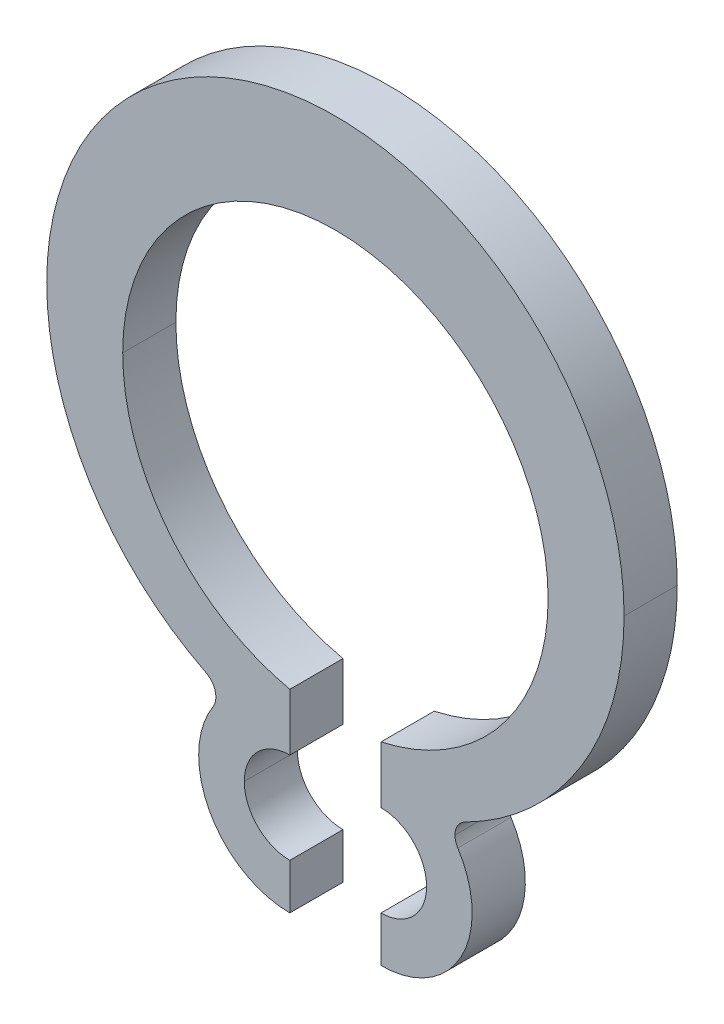
ISO-10303-21;
HEADER;
FILE_DESCRIPTION(('STEP AP214'),'2;1');
FILE_NAME('part.step','',(''),(''),'','','');
FILE_SCHEMA(('AUTOMOTIVE_DESIGN { 1 0 10303 214 1 1 1 1 }'));
ENDSEC;
DATA;
#1=APPLICATION_CONTEXT('core data for automotive mechanical design processes');
#2=APPLICATION_PROTOCOL_DEFINITION('international standard','automotive_design',2000,#1);
#3=PRODUCT_CONTEXT('',#1,'mechanical');
#4=PRODUCT('Part','Part','',(#3));
#5=PRODUCT_RELATED_PRODUCT_CATEGORY('part','',(#4));
#6=PRODUCT_DEFINITION_FORMATION('','',#4);
#7=PRODUCT_DEFINITION_CONTEXT('part definition',#1,'design');
#8=PRODUCT_DEFINITION('design','',#6,#7);
#9=PRODUCT_DEFINITION_SHAPE('','',#8);
#10=(LENGTH_UNIT() NAMED_UNIT(*) SI_UNIT(.MILLI.,.METRE.));
#11=(NAMED_UNIT(*) PLANE_ANGLE_UNIT() SI_UNIT($,.RADIAN.));
#12=(NAMED_UNIT(*) SI_UNIT($,.STERADIAN.) SOLID_ANGLE_UNIT());
#13=UNCERTAINTY_MEASURE_WITH_UNIT(LENGTH_MEASURE(1.E-05),#10,'distance_accuracy_value','');
#14=(GEOMETRIC_REPRESENTATION_CONTEXT(3) GLOBAL_UNCERTAINTY_ASSIGNED_CONTEXT((#13)) GLOBAL_UNIT_ASSIGNED_CONTEXT((#10,
#11,#12)) REPRESENTATION_CONTEXT('',''));
#15=CARTESIAN_POINT('',(0.,0.,0.));
#16=DIRECTION('',(0.,0.,1.));
#17=DIRECTION('',(1.,0.,0.));
#18=AXIS2_PLACEMENT_3D('',#15,#16,#17);
#19=CARTESIAN_POINT('',(-0.6,-4.08495886623547,0.));
#20=DIRECTION('',(0.,0.,1.));
#21=DIRECTION('',(1.,0.,0.));
#22=AXIS2_PLACEMENT_3D('',#19,#20,#21);
#23=PLANE('',#22);
#24=CARTESIAN_POINT('',(-0.6,-4.08495886623547,0.));
#25=DIRECTION('',(0.,0.,1.));
#26=DIRECTION('',(1.,0.,0.));
#27=AXIS2_PLACEMENT_3D('',#24,#25,#26);
#28=CIRCLE('',#27,1.2);
#29=CARTESIAN_POINT('',(-1.61140871688524,-3.43916291749581,0.));
#30=VERTEX_POINT('',#29);
#31=CARTESIAN_POINT('',(-1.8,-4.08495886623547,0.));
#32=VERTEX_POINT('',#31);
#33=EDGE_CURVE('E310',#30,#32,#28,.T.);
#34=ORIENTED_EDGE('',*,*,#33,.F.);
#35=CARTESIAN_POINT('',(-1.81369046026228,-3.31000372774788,0.));
#36=DIRECTION('',(0.,0.,-1.));
#37=DIRECTION('',(1.,0.,0.));
#38=AXIS2_PLACEMENT_3D('',#35,#36,#37);
#39=CIRCLE('',#38,0.24);
#40=CARTESIAN_POINT('',(-1.70594647252393,-3.09554806075295,0.));
#41=VERTEX_POINT('',#40);
#42=EDGE_CURVE('E28',#41,#30,#39,.T.);
#43=ORIENTED_EDGE('',*,*,#42,.F.);
#44=CARTESIAN_POINT('',(0.,0.3,0.));
#45=DIRECTION('',(0.,0.,1.));
#46=DIRECTION('',(1.,0.,0.));
#47=AXIS2_PLACEMENT_3D('',#44,#45,#46);
#48=CIRCLE('',#47,3.8);
#49=CARTESIAN_POINT('',(-3.8,0.3,0.));
#50=VERTEX_POINT('',#49);
#51=EDGE_CURVE('E298',#50,#41,#48,.T.);
#52=ORIENTED_EDGE('',*,*,#51,.F.);
#53=CARTESIAN_POINT('',(0.,0.3,0.));
#54=DIRECTION('',(0.,0.,1.));
#55=DIRECTION('',(1.,0.,0.));
#56=AXIS2_PLACEMENT_3D('',#53,#54,#55);
#57=CIRCLE('',#56,3.8);
#58=CARTESIAN_POINT('',(3.8,0.3,0.));
#59=VERTEX_POINT('',#58);
#60=EDGE_CURVE('E244',#59,#50,#57,.T.);
#61=ORIENTED_EDGE('',*,*,#60,.F.);
#62=CARTESIAN_POINT('',(0.,0.3,0.));
#63=DIRECTION('',(0.,0.,1.));
#64=DIRECTION('',(1.,0.,0.));
#65=AXIS2_PLACEMENT_3D('',#62,#63,#64);
#66=CIRCLE('',#65,3.8);
#67=CARTESIAN_POINT('',(1.70594647252393,-3.09554806075295,0.));
#68=VERTEX_POINT('',#67);
#69=EDGE_CURVE('E268',#68,#59,#66,.T.);
#70=ORIENTED_EDGE('',*,*,#69,.F.);
#71=CARTESIAN_POINT('',(1.81369046026228,-3.31000372774788,0.));
#72=DIRECTION('',(0.,0.,-1.));
#73=DIRECTION('',(1.,0.,0.));
#74=AXIS2_PLACEMENT_3D('',#71,#72,#73);
#75=CIRCLE('',#74,0.24);
#76=CARTESIAN_POINT('',(1.57369046026228,-3.31000372774788,0.));
#77=VERTEX_POINT('',#76);
#78=EDGE_CURVE('E229',#77,#68,#75,.T.);
#79=ORIENTED_EDGE('',*,*,#78,.F.);
#80=CARTESIAN_POINT('',(1.81369046026228,-3.31000372774788,0.));
#81=DIRECTION('',(0.,0.,-1.));
#82=DIRECTION('',(1.,0.,0.));
#83=AXIS2_PLACEMENT_3D('',#80,#81,#82);
#84=CIRCLE('',#83,0.24);
#85=CARTESIAN_POINT('',(1.61140871688524,-3.43916291749581,0.));
#86=VERTEX_POINT('',#85);
#87=EDGE_CURVE('E274',#86,#77,#84,.T.);
#88=ORIENTED_EDGE('',*,*,#87,.F.);
#89=CARTESIAN_POINT('',(0.6,-4.08495886623547,0.));
#90=DIRECTION('',(0.,0.,1.));
#91=DIRECTION('',(1.,0.,0.));
#92=AXIS2_PLACEMENT_3D('',#89,#90,#91);
#93=CIRCLE('',#92,1.2);
#94=CARTESIAN_POINT('',(0.6,-5.28495886623547,0.));
#95=VERTEX_POINT('',#94);
#96=EDGE_CURVE('E210',#95,#86,#93,.T.);
#97=ORIENTED_EDGE('',*,*,#96,.F.);
#98=DIRECTION('',(0.,-1.,0.));
#99=VECTOR('',#98,1.);
#100=CARTESIAN_POINT('',(0.6,-4.68495886623547,0.));
#101=LINE('',#100,#99);
#102=CARTESIAN_POINT('',(0.6,-4.68495886623547,0.));
#103=VERTEX_POINT('',#102);
#104=EDGE_CURVE('E213',#103,#95,#101,.T.);
#105=ORIENTED_EDGE('',*,*,#104,.F.);
#106=CARTESIAN_POINT('',(0.6,-4.08495886623547,0.));
#107=DIRECTION('',(0.,0.,-1.));
#108=DIRECTION('',(1.,0.,0.));
#109=AXIS2_PLACEMENT_3D('',#106,#107,#108);
#110=CIRCLE('',#109,0.6);
#111=CARTESIAN_POINT('',(0.6,-3.48495886623547,0.));
#112=VERTEX_POINT('',#111);
#113=EDGE_CURVE('E278',#112,#103,#110,.T.);
#114=ORIENTED_EDGE('',*,*,#113,.F.);
#115=DIRECTION('',(0.,-1.,0.));
#116=VECTOR('',#115,1.);
#117=CARTESIAN_POINT('',(0.6,-2.73495886623547,0.));
#118=LINE('',#117,#116);
#119=CARTESIAN_POINT('',(0.6,-2.73495886623547,0.));
#120=VERTEX_POINT('',#119);
#121=EDGE_CURVE('E266',#120,#112,#118,.T.);
#122=ORIENTED_EDGE('',*,*,#121,.F.);
#123=CARTESIAN_POINT('',(0.,0.,0.));
#124=DIRECTION('',(0.,0.,-1.));
#125=DIRECTION('',(1.,0.,0.));
#126=AXIS2_PLACEMENT_3D('',#123,#124,#125);
#127=CIRCLE('',#126,2.8);
#128=CARTESIAN_POINT('',(2.8,0.,0.));
#129=VERTEX_POINT('',#128);
#130=EDGE_CURVE('E361',#129,#120,#127,.T.);
#131=ORIENTED_EDGE('',*,*,#130,.F.);
#132=CARTESIAN_POINT('',(0.,0.,0.));
#133=DIRECTION('',(0.,0.,-1.));
#134=DIRECTION('',(1.,0.,0.));
#135=AXIS2_PLACEMENT_3D('',#132,#133,#134);
#136=CIRCLE('',#135,2.8);
#137=CARTESIAN_POINT('',(-2.8,0.,0.));
#138=VERTEX_POINT('',#137);
#139=EDGE_CURVE('E255',#138,#129,#136,.T.);
#140=ORIENTED_EDGE('',*,*,#139,.F.);
#141=CARTESIAN_POINT('',(0.,0.,0.));
#142=DIRECTION('',(0.,0.,-1.));
#143=DIRECTION('',(1.,0.,0.));
#144=AXIS2_PLACEMENT_3D('',#141,#142,#143);
#145=CIRCLE('',#144,2.8);
#146=CARTESIAN_POINT('',(-0.6,-2.73495886623547,0.));
#147=VERTEX_POINT('',#146);
#148=EDGE_CURVE('E263',#147,#138,#145,.T.);
#149=ORIENTED_EDGE('',*,*,#148,.F.);
#150=DIRECTION('',(0.,1.,0.));
#151=VECTOR('',#150,1.);
#152=CARTESIAN_POINT('',(-0.6,-2.73495886623547,0.));
#153=LINE('',#152,#151);
#154=CARTESIAN_POINT('',(-0.6,-3.48495886623547,0.));
#155=VERTEX_POINT('',#154);
#156=EDGE_CURVE('E230',#155,#147,#153,.T.);
#157=ORIENTED_EDGE('',*,*,#156,.F.);
#158=CARTESIAN_POINT('',(-0.6,-4.08495886623547,0.));
#159=DIRECTION('',(0.,0.,-1.));
#160=DIRECTION('',(1.,0.,0.));
#161=AXIS2_PLACEMENT_3D('',#158,#159,#160);
#162=CIRCLE('',#161,0.6);
#163=CARTESIAN_POINT('',(-1.2,-4.08495886623547,0.));
#164=VERTEX_POINT('',#163);
#165=EDGE_CURVE('E293',#164,#155,#162,.T.);
#166=ORIENTED_EDGE('',*,*,#165,.F.);
#167=CARTESIAN_POINT('',(-0.6,-4.08495886623547,0.));
#168=DIRECTION('',(0.,0.,-1.));
#169=DIRECTION('',(1.,0.,0.));
#170=AXIS2_PLACEMENT_3D('',#167,#168,#169);
#171=CIRCLE('',#170,0.6);
#172=CARTESIAN_POINT('',(-0.6,-4.68495886623547,0.));
#173=VERTEX_POINT('',#172);
#174=EDGE_CURVE('E235',#173,#164,#171,.T.);
#175=ORIENTED_EDGE('',*,*,#174,.F.);
#176=DIRECTION('',(0.,1.,0.));
#177=VECTOR('',#176,1.);
#178=CARTESIAN_POINT('',(-0.6,-4.68495886623547,0.));
#179=LINE('',#178,#177);
#180=CARTESIAN_POINT('',(-0.6,-5.28495886623547,0.));
#181=VERTEX_POINT('',#180);
#182=EDGE_CURVE('E314',#181,#173,#179,.T.);
#183=ORIENTED_EDGE('',*,*,#182,.F.);
#184=CARTESIAN_POINT('',(-0.6,-4.08495886623547,0.));
#185=DIRECTION('',(0.,0.,1.));
#186=DIRECTION('',(1.,0.,0.));
#187=AXIS2_PLACEMENT_3D('',#184,#185,#186);
#188=CIRCLE('',#187,1.2);
#189=EDGE_CURVE('E287',#32,#181,#188,.T.);
#190=ORIENTED_EDGE('',*,*,#189,.F.);
#191=EDGE_LOOP('',(#34,#43,#52,#61,#70,#79,#88,#97,#105,#114,#122,#131,#140,#149,#157,#166,#175,
#183,#190));
#192=FACE_BOUND('',#191,.T.);
#193=ADVANCED_FACE('F17',(#192),#23,.F.);
#194=CARTESIAN_POINT('',(-0.6,-4.08495886623547,0.7));
#195=DIRECTION('',(0.,0.,1.));
#196=DIRECTION('',(1.,0.,0.));
#197=AXIS2_PLACEMENT_3D('',#194,#195,#196);
#198=PLANE('',#197);
#199=CARTESIAN_POINT('',(-0.6,-4.08495886623547,0.7));
#200=DIRECTION('',(0.,0.,1.));
#201=DIRECTION('',(1.,0.,0.));
#202=AXIS2_PLACEMENT_3D('',#199,#200,#201);
#203=CIRCLE('',#202,1.2);
#204=CARTESIAN_POINT('',(-1.61140871688524,-3.43916291749581,0.7));
#205=VERTEX_POINT('',#204);
#206=CARTESIAN_POINT('',(-1.8,-4.08495886623547,0.7));
#207=VERTEX_POINT('',#206);
#208=EDGE_CURVE('E311',#205,#207,#203,.T.);
#209=ORIENTED_EDGE('',*,*,#208,.T.);
#210=CARTESIAN_POINT('',(-0.6,-4.08495886623547,0.7));
#211=DIRECTION('',(0.,0.,1.));
#212=DIRECTION('',(1.,0.,0.));
#213=AXIS2_PLACEMENT_3D('',#210,#211,#212);
#214=CIRCLE('',#213,1.2);
#215=CARTESIAN_POINT('',(-0.6,-5.28495886623547,0.7));
#216=VERTEX_POINT('',#215);
#217=EDGE_CURVE('E288',#207,#216,#214,.T.);
#218=ORIENTED_EDGE('',*,*,#217,.T.);
#219=DIRECTION('',(0.,1.,0.));
#220=VECTOR('',#219,1.);
#221=CARTESIAN_POINT('',(-0.6,-4.68495886623547,0.7));
#222=LINE('',#221,#220);
#223=CARTESIAN_POINT('',(-0.6,-4.68495886623547,0.7));
#224=VERTEX_POINT('',#223);
#225=EDGE_CURVE('E325',#216,#224,#222,.T.);
#226=ORIENTED_EDGE('',*,*,#225,.T.);
#227=CARTESIAN_POINT('',(-0.6,-4.08495886623547,0.7));
#228=DIRECTION('',(0.,0.,-1.));
#229=DIRECTION('',(1.,0.,0.));
#230=AXIS2_PLACEMENT_3D('',#227,#228,#229);
#231=CIRCLE('',#230,0.6);
#232=CARTESIAN_POINT('',(-1.2,-4.08495886623547,0.7));
#233=VERTEX_POINT('',#232);
#234=EDGE_CURVE('E238',#224,#233,#231,.T.);
#235=ORIENTED_EDGE('',*,*,#234,.T.);
#236=CARTESIAN_POINT('',(-0.6,-4.08495886623547,0.7));
#237=DIRECTION('',(0.,0.,-1.));
#238=DIRECTION('',(1.,0.,0.));
#239=AXIS2_PLACEMENT_3D('',#236,#237,#238);
#240=CIRCLE('',#239,0.6);
#241=CARTESIAN_POINT('',(-0.6,-3.48495886623547,0.7));
#242=VERTEX_POINT('',#241);
#243=EDGE_CURVE('E294',#233,#242,#240,.T.);
#244=ORIENTED_EDGE('',*,*,#243,.T.);
#245=DIRECTION('',(0.,1.,0.));
#246=VECTOR('',#245,1.);
#247=CARTESIAN_POINT('',(-0.6,-2.73495886623547,0.7));
#248=LINE('',#247,#246);
#249=CARTESIAN_POINT('',(-0.6,-2.73495886623547,0.7));
#250=VERTEX_POINT('',#249);
#251=EDGE_CURVE('E317',#242,#250,#248,.T.);
#252=ORIENTED_EDGE('',*,*,#251,.T.);
#253=CARTESIAN_POINT('',(0.,0.,0.7));
#254=DIRECTION('',(0.,0.,-1.));
#255=DIRECTION('',(1.,0.,0.));
#256=AXIS2_PLACEMENT_3D('',#253,#254,#255);
#257=CIRCLE('',#256,2.8);
#258=CARTESIAN_POINT('',(-2.8,0.,0.7));
#259=VERTEX_POINT('',#258);
#260=EDGE_CURVE('E267',#250,#259,#257,.T.);
#261=ORIENTED_EDGE('',*,*,#260,.T.);
#262=CARTESIAN_POINT('',(0.,0.,0.7));
#263=DIRECTION('',(0.,0.,-1.));
#264=DIRECTION('',(1.,0.,0.));
#265=AXIS2_PLACEMENT_3D('',#262,#263,#264);
#266=CIRCLE('',#265,2.8);
#267=CARTESIAN_POINT('',(2.8,0.,0.7));
#268=VERTEX_POINT('',#267);
#269=EDGE_CURVE('E256',#259,#268,#266,.T.);
#270=ORIENTED_EDGE('',*,*,#269,.T.);
#271=CARTESIAN_POINT('',(0.,0.,0.7));
#272=DIRECTION('',(0.,0.,-1.));
#273=DIRECTION('',(1.,0.,0.));
#274=AXIS2_PLACEMENT_3D('',#271,#272,#273);
#275=CIRCLE('',#274,2.8);
#276=CARTESIAN_POINT('',(0.6,-2.73495886623547,0.7));
#277=VERTEX_POINT('',#276);
#278=EDGE_CURVE('E228',#268,#277,#275,.T.);
#279=ORIENTED_EDGE('',*,*,#278,.T.);
#280=DIRECTION('',(0.,-1.,0.));
#281=VECTOR('',#280,1.);
#282=CARTESIAN_POINT('',(0.6,-2.73495886623547,0.7));
#283=LINE('',#282,#281);
#284=CARTESIAN_POINT('',(0.6,-3.48495886623547,0.7));
#285=VERTEX_POINT('',#284);
#286=EDGE_CURVE('E275',#277,#285,#283,.T.);
#287=ORIENTED_EDGE('',*,*,#286,.T.);
#288=CARTESIAN_POINT('',(0.6,-4.08495886623547,0.7));
#289=DIRECTION('',(0.,0.,-1.));
#290=DIRECTION('',(1.,0.,0.));
#291=AXIS2_PLACEMENT_3D('',#288,#289,#290);
#292=CIRCLE('',#291,0.6);
#293=CARTESIAN_POINT('',(0.6,-4.68495886623547,0.7));
#294=VERTEX_POINT('',#293);
#295=EDGE_CURVE('E205',#285,#294,#292,.T.);
#296=ORIENTED_EDGE('',*,*,#295,.T.);
#297=DIRECTION('',(0.,-1.,0.));
#298=VECTOR('',#297,1.);
#299=CARTESIAN_POINT('',(0.6,-4.68495886623547,0.7));
#300=LINE('',#299,#298);
#301=CARTESIAN_POINT('',(0.6,-5.28495886623547,0.7));
#302=VERTEX_POINT('',#301);
#303=EDGE_CURVE('E202',#294,#302,#300,.T.);
#304=ORIENTED_EDGE('',*,*,#303,.T.);
#305=CARTESIAN_POINT('',(0.6,-4.08495886623547,0.7));
#306=DIRECTION('',(0.,0.,1.));
#307=DIRECTION('',(1.,0.,0.));
#308=AXIS2_PLACEMENT_3D('',#305,#306,#307);
#309=CIRCLE('',#308,1.2);
#310=CARTESIAN_POINT('',(1.61140871688524,-3.43916291749581,0.7));
#311=VERTEX_POINT('',#310);
#312=EDGE_CURVE('E190',#302,#311,#309,.T.);
#313=ORIENTED_EDGE('',*,*,#312,.T.);
#314=CARTESIAN_POINT('',(1.81369046026228,-3.31000372774788,0.7));
#315=DIRECTION('',(0.,0.,-1.));
#316=DIRECTION('',(1.,0.,0.));
#317=AXIS2_PLACEMENT_3D('',#314,#315,#316);
#318=CIRCLE('',#317,0.24);
#319=CARTESIAN_POINT('',(1.57369046026228,-3.31000372774788,0.7));
#320=VERTEX_POINT('',#319);
#321=EDGE_CURVE('E43',#311,#320,#318,.T.);
#322=ORIENTED_EDGE('',*,*,#321,.T.);
#323=CARTESIAN_POINT('',(1.81369046026228,-3.31000372774788,0.7));
#324=DIRECTION('',(0.,0.,-1.));
#325=DIRECTION('',(1.,0.,0.));
#326=AXIS2_PLACEMENT_3D('',#323,#324,#325);
#327=CIRCLE('',#326,0.24);
#328=CARTESIAN_POINT('',(1.70594647252393,-3.09554806075295,0.7));
#329=VERTEX_POINT('',#328);
#330=EDGE_CURVE('E257',#320,#329,#327,.T.);
#331=ORIENTED_EDGE('',*,*,#330,.T.);
#332=CARTESIAN_POINT('',(0.,0.3,0.7));
#333=DIRECTION('',(0.,0.,1.));
#334=DIRECTION('',(1.,0.,0.));
#335=AXIS2_PLACEMENT_3D('',#332,#333,#334);
#336=CIRCLE('',#335,3.8);
#337=CARTESIAN_POINT('',(3.8,0.3,0.7));
#338=VERTEX_POINT('',#337);
#339=EDGE_CURVE('E271',#329,#338,#336,.T.);
#340=ORIENTED_EDGE('',*,*,#339,.T.);
#341=CARTESIAN_POINT('',(0.,0.3,0.7));
#342=DIRECTION('',(0.,0.,1.));
#343=DIRECTION('',(1.,0.,0.));
#344=AXIS2_PLACEMENT_3D('',#341,#342,#343);
#345=CIRCLE('',#344,3.8);
#346=CARTESIAN_POINT('',(-3.8,0.3,0.7));
#347=VERTEX_POINT('',#346);
#348=EDGE_CURVE('E335',#338,#347,#345,.T.);
#349=ORIENTED_EDGE('',*,*,#348,.T.);
#350=CARTESIAN_POINT('',(0.,0.3,0.7));
#351=DIRECTION('',(0.,0.,1.));
#352=DIRECTION('',(1.,0.,0.));
#353=AXIS2_PLACEMENT_3D('',#350,#351,#352);
#354=CIRCLE('',#353,3.8);
#355=CARTESIAN_POINT('',(-1.70594647252393,-3.09554806075295,0.7));
#356=VERTEX_POINT('',#355);
#357=EDGE_CURVE('E243',#347,#356,#354,.T.);
#358=ORIENTED_EDGE('',*,*,#357,.T.);
#359=CARTESIAN_POINT('',(-1.81369046026228,-3.31000372774788,0.7));
#360=DIRECTION('',(0.,0.,-1.));
#361=DIRECTION('',(1.,0.,0.));
#362=AXIS2_PLACEMENT_3D('',#359,#360,#361);
#363=CIRCLE('',#362,0.24);
#364=EDGE_CURVE('E11',#356,#205,#363,.T.);
#365=ORIENTED_EDGE('',*,*,#364,.T.);
#366=EDGE_LOOP('',(#209,#218,#226,#235,#244,#252,#261,#270,#279,#287,#296,#304,#313,#322,#331,
#340,#349,#358,#365));
#367=FACE_BOUND('',#366,.T.);
#368=ADVANCED_FACE('F203',(#367),#198,.T.);
#369=CARTESIAN_POINT('',(-1.81369046026228,-3.31000372774788,0.7));
#370=DIRECTION('',(0.,0.,-1.));
#371=DIRECTION('',(-1.,0.,0.));
#372=AXIS2_PLACEMENT_3D('',#369,#370,#371);
#373=CYLINDRICAL_SURFACE('',#372,0.24);
#374=ORIENTED_EDGE('',*,*,#42,.T.);
#375=DIRECTION('',(0.,0.,-1.));
#376=VECTOR('',#375,1.);
#377=CARTESIAN_POINT('',(-1.61140871688524,-3.43916291749581,0.7));
#378=LINE('',#377,#376);
#379=EDGE_CURVE('E306',#205,#30,#378,.T.);
#380=ORIENTED_EDGE('',*,*,#379,.F.);
#381=ORIENTED_EDGE('',*,*,#364,.F.);
#382=DIRECTION('',(0.,0.,-1.));
#383=VECTOR('',#382,1.);
#384=CARTESIAN_POINT('',(-1.70594647252393,-3.09554806075295,0.7));
#385=LINE('',#384,#383);
#386=EDGE_CURVE('E262',#356,#41,#385,.T.);
#387=ORIENTED_EDGE('',*,*,#386,.T.);
#388=EDGE_LOOP('',(#374,#380,#381,#387));
#389=FACE_BOUND('',#388,.T.);
#390=ADVANCED_FACE('F393',(#389),#373,.F.);
#391=CARTESIAN_POINT('',(0.,0.3,0.7));
#392=DIRECTION('',(0.,0.,-1.));
#393=DIRECTION('',(-1.,0.,0.));
#394=AXIS2_PLACEMENT_3D('',#391,#392,#393);
#395=CYLINDRICAL_SURFACE('',#394,3.8);
#396=DIRECTION('',(0.,0.,-1.));
#397=VECTOR('',#396,1.);
#398=CARTESIAN_POINT('',(3.8,0.3,0.7));
#399=LINE('',#398,#397);
#400=EDGE_CURVE('E339',#338,#59,#399,.T.);
#401=ORIENTED_EDGE('',*,*,#400,.F.);
#402=ORIENTED_EDGE('',*,*,#339,.F.);
#403=DIRECTION('',(0.,0.,-1.));
#404=VECTOR('',#403,1.);
#405=CARTESIAN_POINT('',(1.70594647252393,-3.09554806075295,0.7));
#406=LINE('',#405,#404);
#407=EDGE_CURVE('E224',#329,#68,#406,.T.);
#408=ORIENTED_EDGE('',*,*,#407,.T.);
#409=ORIENTED_EDGE('',*,*,#69,.T.);
#410=EDGE_LOOP('',(#401,#402,#408,#409));
#411=FACE_BOUND('',#410,.T.);
#412=ADVANCED_FACE('F379',(#411),#395,.T.);
#413=CARTESIAN_POINT('',(1.81369046026228,-3.31000372774788,0.7));
#414=DIRECTION('',(0.,0.,-1.));
#415=DIRECTION('',(-1.,0.,0.));
#416=AXIS2_PLACEMENT_3D('',#413,#414,#415);
#417=CYLINDRICAL_SURFACE('',#416,0.24);
#418=DIRECTION('',(0.,0.,-1.));
#419=VECTOR('',#418,1.);
#420=CARTESIAN_POINT('',(1.57369046026228,-3.31000372774788,0.7));
#421=LINE('',#420,#419);
#422=EDGE_CURVE('E261',#320,#77,#421,.T.);
#423=ORIENTED_EDGE('',*,*,#422,.F.);
#424=ORIENTED_EDGE('',*,*,#321,.F.);
#425=DIRECTION('',(0.,0.,-1.));
#426=VECTOR('',#425,1.);
#427=CARTESIAN_POINT('',(1.61140871688524,-3.43916291749581,0.7));
#428=LINE('',#427,#426);
#429=EDGE_CURVE('E197',#311,#86,#428,.T.);
#430=ORIENTED_EDGE('',*,*,#429,.T.);
#431=ORIENTED_EDGE('',*,*,#87,.T.);
#432=EDGE_LOOP('',(#423,#424,#430,#431));
#433=FACE_BOUND('',#432,.T.);
#434=ADVANCED_FACE('F371',(#433),#417,.F.);
#435=CARTESIAN_POINT('',(0.6,-4.08495886623547,0.7));
#436=DIRECTION('',(0.,0.,-1.));
#437=DIRECTION('',(-1.,0.,0.));
#438=AXIS2_PLACEMENT_3D('',#435,#436,#437);
#439=CYLINDRICAL_SURFACE('',#438,1.2);
#440=ORIENTED_EDGE('',*,*,#96,.T.);
#441=ORIENTED_EDGE('',*,*,#429,.F.);
#442=ORIENTED_EDGE('',*,*,#312,.F.);
#443=DIRECTION('',(0.,0.,-1.));
#444=VECTOR('',#443,1.);
#445=CARTESIAN_POINT('',(0.6,-5.28495886623547,0.7));
#446=LINE('',#445,#444);
#447=EDGE_CURVE('E195',#302,#95,#446,.T.);
#448=ORIENTED_EDGE('',*,*,#447,.T.);
#449=EDGE_LOOP('',(#440,#441,#442,#448));
#450=FACE_BOUND('',#449,.T.);
#451=ADVANCED_FACE('F193',(#450),#439,.T.);
#452=CARTESIAN_POINT('',(0.6,-4.68495886623547,0.7));
#453=DIRECTION('',(1.,0.,0.));
#454=DIRECTION('',(0.,1.,0.));
#455=AXIS2_PLACEMENT_3D('',#452,#453,#454);
#456=PLANE('',#455);
#457=ORIENTED_EDGE('',*,*,#104,.T.);
#458=ORIENTED_EDGE('',*,*,#447,.F.);
#459=ORIENTED_EDGE('',*,*,#303,.F.);
#460=DIRECTION('',(0.,0.,-1.));
#461=VECTOR('',#460,1.);
#462=CARTESIAN_POINT('',(0.6,-4.68495886623547,0.7));
#463=LINE('',#462,#461);
#464=EDGE_CURVE('E21',#294,#103,#463,.T.);
#465=ORIENTED_EDGE('',*,*,#464,.T.);
#466=EDGE_LOOP('',(#457,#458,#459,#465));
#467=FACE_BOUND('',#466,.T.);
#468=ADVANCED_FACE('F212',(#467),#456,.F.);
#469=CARTESIAN_POINT('',(0.6,-4.08495886623547,0.7));
#470=DIRECTION('',(0.,0.,-1.));
#471=DIRECTION('',(-1.,0.,0.));
#472=AXIS2_PLACEMENT_3D('',#469,#470,#471);
#473=CYLINDRICAL_SURFACE('',#472,0.6);
#474=ORIENTED_EDGE('',*,*,#113,.T.);
#475=ORIENTED_EDGE('',*,*,#464,.F.);
#476=ORIENTED_EDGE('',*,*,#295,.F.);
#477=DIRECTION('',(0.,0.,-1.));
#478=VECTOR('',#477,1.);
#479=CARTESIAN_POINT('',(0.6,-3.48495886623547,0.7));
#480=LINE('',#479,#478);
#481=EDGE_CURVE('E279',#285,#112,#480,.T.);
#482=ORIENTED_EDGE('',*,*,#481,.T.);
#483=EDGE_LOOP('',(#474,#475,#476,#482));
#484=FACE_BOUND('',#483,.T.);
#485=ADVANCED_FACE('F431',(#484),#473,.F.);
#486=CARTESIAN_POINT('',(0.6,-2.73495886623547,0.7));
#487=DIRECTION('',(1.,0.,0.));
#488=DIRECTION('',(0.,-1.,0.));
#489=AXIS2_PLACEMENT_3D('',#486,#487,#488);
#490=PLANE('',#489);
#491=ORIENTED_EDGE('',*,*,#121,.T.);
#492=ORIENTED_EDGE('',*,*,#481,.F.);
#493=ORIENTED_EDGE('',*,*,#286,.F.);
#494=DIRECTION('',(0.,0.,-1.));
#495=VECTOR('',#494,1.);
#496=CARTESIAN_POINT('',(0.6,-2.73495886623547,0.7));
#497=LINE('',#496,#495);
#498=EDGE_CURVE('E358',#277,#120,#497,.T.);
#499=ORIENTED_EDGE('',*,*,#498,.T.);
#500=EDGE_LOOP('',(#491,#492,#493,#499));
#501=FACE_BOUND('',#500,.T.);
#502=ADVANCED_FACE('F424',(#501),#490,.F.);
#503=CARTESIAN_POINT('',(0.,0.,0.7));
#504=DIRECTION('',(0.,0.,-1.));
#505=DIRECTION('',(-1.,0.,0.));
#506=AXIS2_PLACEMENT_3D('',#503,#504,#505);
#507=CYLINDRICAL_SURFACE('',#506,2.8);
#508=DIRECTION('',(0.,0.,-1.));
#509=VECTOR('',#508,1.);
#510=CARTESIAN_POINT('',(-2.8,0.,0.7));
#511=LINE('',#510,#509);
#512=EDGE_CURVE('E251',#259,#138,#511,.T.);
#513=ORIENTED_EDGE('',*,*,#512,.F.);
#514=ORIENTED_EDGE('',*,*,#260,.F.);
#515=DIRECTION('',(0.,0.,-1.));
#516=VECTOR('',#515,1.);
#517=CARTESIAN_POINT('',(-0.6,-2.73495886623547,0.7));
#518=LINE('',#517,#516);
#519=EDGE_CURVE('E234',#250,#147,#518,.T.);
#520=ORIENTED_EDGE('',*,*,#519,.T.);
#521=ORIENTED_EDGE('',*,*,#148,.T.);
#522=EDGE_LOOP('',(#513,#514,#520,#521));
#523=FACE_BOUND('',#522,.T.);
#524=ADVANCED_FACE('F19',(#523),#507,.F.);
#525=CARTESIAN_POINT('',(-0.6,-2.73495886623547,0.7));
#526=DIRECTION('',(-1.,0.,0.));
#527=DIRECTION('',(0.,0.,1.));
#528=AXIS2_PLACEMENT_3D('',#525,#526,#527);
#529=PLANE('',#528);
#530=ORIENTED_EDGE('',*,*,#156,.T.);
#531=ORIENTED_EDGE('',*,*,#519,.F.);
#532=ORIENTED_EDGE('',*,*,#251,.F.);
#533=DIRECTION('',(0.,0.,-1.));
#534=VECTOR('',#533,1.);
#535=CARTESIAN_POINT('',(-0.6,-3.48495886623547,0.7));
#536=LINE('',#535,#534);
#537=EDGE_CURVE('E305',#242,#155,#536,.T.);
#538=ORIENTED_EDGE('',*,*,#537,.T.);
#539=EDGE_LOOP('',(#530,#531,#532,#538));
#540=FACE_BOUND('',#539,.T.);
#541=ADVANCED_FACE('F563',(#540),#529,.F.);
#542=CARTESIAN_POINT('',(-0.6,-4.08495886623547,0.7));
#543=DIRECTION('',(0.,0.,-1.));
#544=DIRECTION('',(-1.,0.,0.));
#545=AXIS2_PLACEMENT_3D('',#542,#543,#544);
#546=CYLINDRICAL_SURFACE('',#545,0.6);
#547=DIRECTION('',(0.,0.,-1.));
#548=VECTOR('',#547,1.);
#549=CARTESIAN_POINT('',(-1.2,-4.08495886623547,0.7));
#550=LINE('',#549,#548);
#551=EDGE_CURVE('E289',#233,#164,#550,.T.);
#552=ORIENTED_EDGE('',*,*,#551,.F.);
#553=ORIENTED_EDGE('',*,*,#234,.F.);
#554=DIRECTION('',(0.,0.,-1.));
#555=VECTOR('',#554,1.);
#556=CARTESIAN_POINT('',(-0.6,-4.68495886623547,0.7));
#557=LINE('',#556,#555);
#558=EDGE_CURVE('E321',#224,#173,#557,.T.);
#559=ORIENTED_EDGE('',*,*,#558,.T.);
#560=ORIENTED_EDGE('',*,*,#174,.T.);
#561=EDGE_LOOP('',(#552,#553,#559,#560));
#562=FACE_BOUND('',#561,.T.);
#563=ADVANCED_FACE('F409',(#562),#546,.F.);
#564=CARTESIAN_POINT('',(-0.6,-4.68495886623547,0.7));
#565=DIRECTION('',(-1.,0.,0.));
#566=DIRECTION('',(0.,1.,0.));
#567=AXIS2_PLACEMENT_3D('',#564,#565,#566);
#568=PLANE('',#567);
#569=ORIENTED_EDGE('',*,*,#182,.T.);
#570=ORIENTED_EDGE('',*,*,#558,.F.);
#571=ORIENTED_EDGE('',*,*,#225,.F.);
#572=DIRECTION('',(0.,0.,-1.));
#573=VECTOR('',#572,1.);
#574=CARTESIAN_POINT('',(-0.6,-5.28495886623547,0.7));
#575=LINE('',#574,#573);
#576=EDGE_CURVE('E347',#216,#181,#575,.T.);
#577=ORIENTED_EDGE('',*,*,#576,.T.);
#578=EDGE_LOOP('',(#569,#570,#571,#577));
#579=FACE_BOUND('',#578,.T.);
#580=ADVANCED_FACE('F407',(#579),#568,.F.);
#581=CARTESIAN_POINT('',(-0.6,-4.08495886623547,0.7));
#582=DIRECTION('',(0.,0.,-1.));
#583=DIRECTION('',(-1.,0.,0.));
#584=AXIS2_PLACEMENT_3D('',#581,#582,#583);
#585=CYLINDRICAL_SURFACE('',#584,1.2);
#586=DIRECTION('',(0.,0.,-1.));
#587=VECTOR('',#586,1.);
#588=CARTESIAN_POINT('',(-1.8,-4.08495886623547,0.7));
#589=LINE('',#588,#587);
#590=EDGE_CURVE('E283',#207,#32,#589,.T.);
#591=ORIENTED_EDGE('',*,*,#590,.F.);
#592=ORIENTED_EDGE('',*,*,#208,.F.);
#593=ORIENTED_EDGE('',*,*,#379,.T.);
#594=ORIENTED_EDGE('',*,*,#33,.T.);
#595=EDGE_LOOP('',(#591,#592,#593,#594));
#596=FACE_BOUND('',#595,.T.);
#597=ADVANCED_FACE('F395',(#596),#585,.T.);
#598=CARTESIAN_POINT('',(-0.6,-4.08495886623547,0.7));
#599=DIRECTION('',(0.,0.,-1.));
#600=DIRECTION('',(-1.,0.,0.));
#601=AXIS2_PLACEMENT_3D('',#598,#599,#600);
#602=CYLINDRICAL_SURFACE('',#601,1.2);
#603=ORIENTED_EDGE('',*,*,#217,.F.);
#604=ORIENTED_EDGE('',*,*,#590,.T.);
#605=ORIENTED_EDGE('',*,*,#189,.T.);
#606=ORIENTED_EDGE('',*,*,#576,.F.);
#607=EDGE_LOOP('',(#603,#604,#605,#606));
#608=FACE_BOUND('',#607,.T.);
#609=ADVANCED_FACE('F400',(#608),#602,.T.);
#610=CARTESIAN_POINT('',(-0.6,-4.08495886623547,0.7));
#611=DIRECTION('',(0.,0.,-1.));
#612=DIRECTION('',(-1.,0.,0.));
#613=AXIS2_PLACEMENT_3D('',#610,#611,#612);
#614=CYLINDRICAL_SURFACE('',#613,0.6);
#615=ORIENTED_EDGE('',*,*,#243,.F.);
#616=ORIENTED_EDGE('',*,*,#551,.T.);
#617=ORIENTED_EDGE('',*,*,#165,.T.);
#618=ORIENTED_EDGE('',*,*,#537,.F.);
#619=EDGE_LOOP('',(#615,#616,#617,#618));
#620=FACE_BOUND('',#619,.T.);
#621=ADVANCED_FACE('F626',(#620),#614,.F.);
#622=CARTESIAN_POINT('',(0.,0.,0.7));
#623=DIRECTION('',(0.,0.,-1.));
#624=DIRECTION('',(-1.,0.,0.));
#625=AXIS2_PLACEMENT_3D('',#622,#623,#624);
#626=CYLINDRICAL_SURFACE('',#625,2.8);
#627=DIRECTION('',(0.,0.,-1.));
#628=VECTOR('',#627,1.);
#629=CARTESIAN_POINT('',(2.8,0.,0.7));
#630=LINE('',#629,#628);
#631=EDGE_CURVE('E248',#268,#129,#630,.T.);
#632=ORIENTED_EDGE('',*,*,#631,.F.);
#633=ORIENTED_EDGE('',*,*,#269,.F.);
#634=ORIENTED_EDGE('',*,*,#512,.T.);
#635=ORIENTED_EDGE('',*,*,#139,.T.);
#636=EDGE_LOOP('',(#632,#633,#634,#635));
#637=FACE_BOUND('',#636,.T.);
#638=ADVANCED_FACE('F618',(#637),#626,.F.);
#639=CARTESIAN_POINT('',(0.,0.,0.7));
#640=DIRECTION('',(0.,0.,-1.));
#641=DIRECTION('',(-1.,0.,0.));
#642=AXIS2_PLACEMENT_3D('',#639,#640,#641);
#643=CYLINDRICAL_SURFACE('',#642,2.8);
#644=ORIENTED_EDGE('',*,*,#278,.F.);
#645=ORIENTED_EDGE('',*,*,#631,.T.);
#646=ORIENTED_EDGE('',*,*,#130,.T.);
#647=ORIENTED_EDGE('',*,*,#498,.F.);
#648=EDGE_LOOP('',(#644,#645,#646,#647));
#649=FACE_BOUND('',#648,.T.);
#650=ADVANCED_FACE('F434',(#649),#643,.F.);
#651=CARTESIAN_POINT('',(1.81369046026228,-3.31000372774788,0.7));
#652=DIRECTION('',(0.,0.,-1.));
#653=DIRECTION('',(-1.,0.,0.));
#654=AXIS2_PLACEMENT_3D('',#651,#652,#653);
#655=CYLINDRICAL_SURFACE('',#654,0.24);
#656=ORIENTED_EDGE('',*,*,#330,.F.);
#657=ORIENTED_EDGE('',*,*,#422,.T.);
#658=ORIENTED_EDGE('',*,*,#78,.T.);
#659=ORIENTED_EDGE('',*,*,#407,.F.);
#660=EDGE_LOOP('',(#656,#657,#658,#659));
#661=FACE_BOUND('',#660,.T.);
#662=ADVANCED_FACE('F368',(#661),#655,.F.);
#663=CARTESIAN_POINT('',(0.,0.3,0.7));
#664=DIRECTION('',(0.,0.,-1.));
#665=DIRECTION('',(-1.,0.,0.));
#666=AXIS2_PLACEMENT_3D('',#663,#664,#665);
#667=CYLINDRICAL_SURFACE('',#666,3.8);
#668=ORIENTED_EDGE('',*,*,#357,.F.);
#669=DIRECTION('',(0.,0.,-1.));
#670=VECTOR('',#669,1.);
#671=CARTESIAN_POINT('',(-3.8,0.3,0.7));
#672=LINE('',#671,#670);
#673=EDGE_CURVE('E239',#347,#50,#672,.T.);
#674=ORIENTED_EDGE('',*,*,#673,.T.);
#675=ORIENTED_EDGE('',*,*,#51,.T.);
#676=ORIENTED_EDGE('',*,*,#386,.F.);
#677=EDGE_LOOP('',(#668,#674,#675,#676));
#678=FACE_BOUND('',#677,.T.);
#679=ADVANCED_FACE('F387',(#678),#667,.T.);
#680=CARTESIAN_POINT('',(0.,0.3,0.7));
#681=DIRECTION('',(0.,0.,-1.));
#682=DIRECTION('',(-1.,0.,0.));
#683=AXIS2_PLACEMENT_3D('',#680,#681,#682);
#684=CYLINDRICAL_SURFACE('',#683,3.8);
#685=ORIENTED_EDGE('',*,*,#348,.F.);
#686=ORIENTED_EDGE('',*,*,#400,.T.);
#687=ORIENTED_EDGE('',*,*,#60,.T.);
#688=ORIENTED_EDGE('',*,*,#673,.F.);
#689=EDGE_LOOP('',(#685,#686,#687,#688));
#690=FACE_BOUND('',#689,.T.);
#691=ADVANCED_FACE('F385',(#690),#684,.T.);
#692=CLOSED_SHELL('',(#193,#368,#390,#412,#434,#451,#468,#485,#502,#524,#541,#563,#580,#597,
#609,#621,#638,#650,#662,#679,#691));
#693=MANIFOLD_SOLID_BREP('B1',#692);
#694=ADVANCED_BREP_SHAPE_REPRESENTATION('',(#18,#693),#14);
#695=SHAPE_DEFINITION_REPRESENTATION(#9,#694);
ENDSEC;
END-ISO-10303-21;
